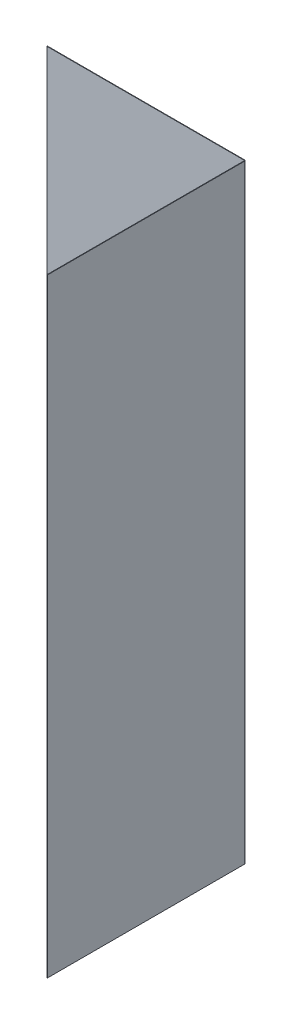
ISO-10303-21;
HEADER;
FILE_DESCRIPTION(('STEP AP214'),'2;1');
FILE_NAME('part.step','',(''),(''),'','','');
FILE_SCHEMA(('AUTOMOTIVE_DESIGN { 1 0 10303 214 1 1 1 1 }'));
ENDSEC;
DATA;
#1=APPLICATION_CONTEXT('core data for automotive mechanical design processes');
#2=APPLICATION_PROTOCOL_DEFINITION('international standard','automotive_design',2000,#1);
#3=PRODUCT_CONTEXT('',#1,'mechanical');
#4=PRODUCT('Part','Part','',(#3));
#5=PRODUCT_RELATED_PRODUCT_CATEGORY('part','',(#4));
#6=PRODUCT_DEFINITION_FORMATION('','',#4);
#7=PRODUCT_DEFINITION_CONTEXT('part definition',#1,'design');
#8=PRODUCT_DEFINITION('design','',#6,#7);
#9=PRODUCT_DEFINITION_SHAPE('','',#8);
#10=(LENGTH_UNIT() NAMED_UNIT(*) SI_UNIT(.MILLI.,.METRE.));
#11=(NAMED_UNIT(*) PLANE_ANGLE_UNIT() SI_UNIT($,.RADIAN.));
#12=(NAMED_UNIT(*) SI_UNIT($,.STERADIAN.) SOLID_ANGLE_UNIT());
#13=UNCERTAINTY_MEASURE_WITH_UNIT(LENGTH_MEASURE(1.E-05),#10,'distance_accuracy_value','');
#14=(GEOMETRIC_REPRESENTATION_CONTEXT(3) GLOBAL_UNCERTAINTY_ASSIGNED_CONTEXT((#13)) GLOBAL_UNIT_ASSIGNED_CONTEXT((#10,
#11,#12)) REPRESENTATION_CONTEXT('',''));
#15=CARTESIAN_POINT('',(0.,0.,0.));
#16=DIRECTION('',(0.,0.,1.));
#17=DIRECTION('',(1.,0.,0.));
#18=AXIS2_PLACEMENT_3D('',#15,#16,#17);
#19=CARTESIAN_POINT('',(-93.7000000000001,-731.,91.3));
#20=DIRECTION('',(0.,-1.,0.));
#21=DIRECTION('',(0.,0.,-1.));
#22=AXIS2_PLACEMENT_3D('',#19,#20,#21);
#23=PLANE('',#22);
#24=DIRECTION('',(0.,0.,1.));
#25=VECTOR('',#24,1.);
#26=CARTESIAN_POINT('',(-92.5,-731.,92.5));
#27=LINE('',#26,#25);
#28=CARTESIAN_POINT('',(-92.5,-731.,93.7));
#29=VERTEX_POINT('',#28);
#30=CARTESIAN_POINT('',(-92.5,-731.,567.5));
#31=VERTEX_POINT('',#30);
#32=EDGE_CURVE('E81',#29,#31,#27,.T.);
#33=ORIENTED_EDGE('',*,*,#32,.F.);
#34=DIRECTION('',(1.,0.,0.));
#35=VECTOR('',#34,1.);
#36=CARTESIAN_POINT('',(-92.5,-731.,93.7));
#37=LINE('',#36,#35);
#38=CARTESIAN_POINT('',(-91.3,-731.,93.7));
#39=VERTEX_POINT('',#38);
#40=EDGE_CURVE('E102',#29,#39,#37,.T.);
#41=ORIENTED_EDGE('',*,*,#40,.T.);
#42=DIRECTION('',(0.,0.,1.));
#43=VECTOR('',#42,1.);
#44=CARTESIAN_POINT('',(-91.3,-731.,92.5));
#45=LINE('',#44,#43);
#46=CARTESIAN_POINT('',(-91.3,-731.,567.5));
#47=VERTEX_POINT('',#46);
#48=EDGE_CURVE('E58',#39,#47,#45,.T.);
#49=ORIENTED_EDGE('',*,*,#48,.T.);
#50=DIRECTION('',(-1.,0.,0.));
#51=VECTOR('',#50,1.);
#52=CARTESIAN_POINT('',(-91.3,-731.,567.5));
#53=LINE('',#52,#51);
#54=EDGE_CURVE('E89',#47,#31,#53,.T.);
#55=ORIENTED_EDGE('',*,*,#54,.T.);
#56=EDGE_LOOP('',(#33,#41,#49,#55));
#57=FACE_BOUND('',#56,.T.);
#58=ADVANCED_FACE('F36',(#57),#23,.T.);
#59=CARTESIAN_POINT('',(-92.5,-731.,92.5));
#60=DIRECTION('',(-1.,0.,0.));
#61=DIRECTION('',(0.,0.,1.));
#62=AXIS2_PLACEMENT_3D('',#59,#60,#61);
#63=PLANE('',#62);
#64=DIRECTION('',(0.,0.,1.));
#65=VECTOR('',#64,1.);
#66=CARTESIAN_POINT('',(-92.5,731.,92.5));
#67=LINE('',#66,#65);
#68=CARTESIAN_POINT('',(-92.5,731.,93.7));
#69=VERTEX_POINT('',#68);
#70=CARTESIAN_POINT('',(-92.5,731.,567.5));
#71=VERTEX_POINT('',#70);
#72=EDGE_CURVE('E94',#69,#71,#67,.T.);
#73=ORIENTED_EDGE('',*,*,#72,.F.);
#74=DIRECTION('',(0.,1.,0.));
#75=VECTOR('',#74,1.);
#76=CARTESIAN_POINT('',(-92.5,-731.,93.7));
#77=LINE('',#76,#75);
#78=EDGE_CURVE('E43',#29,#69,#77,.T.);
#79=ORIENTED_EDGE('',*,*,#78,.F.);
#80=ORIENTED_EDGE('',*,*,#32,.T.);
#81=DIRECTION('',(0.,1.,0.));
#82=VECTOR('',#81,1.);
#83=CARTESIAN_POINT('',(-92.5,-731.,567.5));
#84=LINE('',#83,#82);
#85=EDGE_CURVE('E90',#31,#71,#84,.T.);
#86=ORIENTED_EDGE('',*,*,#85,.T.);
#87=EDGE_LOOP('',(#73,#79,#80,#86));
#88=FACE_BOUND('',#87,.T.);
#89=ADVANCED_FACE('F166',(#88),#63,.T.);
#90=CARTESIAN_POINT('',(-91.3,-731.,92.5));
#91=DIRECTION('',(-1.,0.,0.));
#92=DIRECTION('',(0.,0.,1.));
#93=AXIS2_PLACEMENT_3D('',#90,#91,#92);
#94=PLANE('',#93);
#95=DIRECTION('',(0.,0.,1.));
#96=VECTOR('',#95,1.);
#97=CARTESIAN_POINT('',(-91.3,731.,92.5));
#98=LINE('',#97,#96);
#99=CARTESIAN_POINT('',(-91.3,731.,93.7));
#100=VERTEX_POINT('',#99);
#101=CARTESIAN_POINT('',(-91.3,731.,567.5));
#102=VERTEX_POINT('',#101);
#103=EDGE_CURVE('E71',#100,#102,#98,.T.);
#104=ORIENTED_EDGE('',*,*,#103,.T.);
#105=DIRECTION('',(0.,1.,0.));
#106=VECTOR('',#105,1.);
#107=CARTESIAN_POINT('',(-91.3,-731.,567.5));
#108=LINE('',#107,#106);
#109=EDGE_CURVE('E74',#47,#102,#108,.T.);
#110=ORIENTED_EDGE('',*,*,#109,.F.);
#111=ORIENTED_EDGE('',*,*,#48,.F.);
#112=DIRECTION('',(0.,1.,0.));
#113=VECTOR('',#112,1.);
#114=CARTESIAN_POINT('',(-91.3,-731.,93.7));
#115=LINE('',#114,#113);
#116=EDGE_CURVE('E78',#39,#100,#115,.T.);
#117=ORIENTED_EDGE('',*,*,#116,.T.);
#118=EDGE_LOOP('',(#104,#110,#111,#117));
#119=FACE_BOUND('',#118,.T.);
#120=ADVANCED_FACE('F73',(#119),#94,.F.);
#121=CARTESIAN_POINT('',(-91.3,-731.,567.5));
#122=DIRECTION('',(0.,0.,-1.));
#123=DIRECTION('',(-1.,0.,0.));
#124=AXIS2_PLACEMENT_3D('',#121,#122,#123);
#125=PLANE('',#124);
#126=DIRECTION('',(-1.,0.,0.));
#127=VECTOR('',#126,1.);
#128=CARTESIAN_POINT('',(-91.3,731.,567.5));
#129=LINE('',#128,#127);
#130=EDGE_CURVE('E82',#102,#71,#129,.T.);
#131=ORIENTED_EDGE('',*,*,#130,.T.);
#132=ORIENTED_EDGE('',*,*,#85,.F.);
#133=ORIENTED_EDGE('',*,*,#54,.F.);
#134=ORIENTED_EDGE('',*,*,#109,.T.);
#135=EDGE_LOOP('',(#131,#132,#133,#134));
#136=FACE_BOUND('',#135,.T.);
#137=ADVANCED_FACE('F86',(#136),#125,.F.);
#138=CARTESIAN_POINT('',(-93.7000000000001,731.,93.7));
#139=DIRECTION('',(0.,1.,0.));
#140=DIRECTION('',(1.,0.,0.));
#141=AXIS2_PLACEMENT_3D('',#138,#139,#140);
#142=PLANE('',#141);
#143=ORIENTED_EDGE('',*,*,#72,.T.);
#144=ORIENTED_EDGE('',*,*,#130,.F.);
#145=ORIENTED_EDGE('',*,*,#103,.F.);
#146=DIRECTION('',(-1.,0.,0.));
#147=VECTOR('',#146,1.);
#148=CARTESIAN_POINT('',(-91.3,731.,93.7));
#149=LINE('',#148,#147);
#150=EDGE_CURVE('E11',#100,#69,#149,.T.);
#151=ORIENTED_EDGE('',*,*,#150,.T.);
#152=EDGE_LOOP('',(#143,#144,#145,#151));
#153=FACE_BOUND('',#152,.T.);
#154=ADVANCED_FACE('F92',(#153),#142,.T.);
#155=CARTESIAN_POINT('',(-567.5,-731.,92.5));
#156=DIRECTION('',(1.,0.,0.));
#157=DIRECTION('',(0.,0.,-1.));
#158=AXIS2_PLACEMENT_3D('',#155,#156,#157);
#159=PLANE('',#158);
#160=DIRECTION('',(0.,0.,-1.));
#161=VECTOR('',#160,1.);
#162=CARTESIAN_POINT('',(-567.5,731.,92.5));
#163=LINE('',#162,#161);
#164=CARTESIAN_POINT('',(-567.5,731.,92.5));
#165=VERTEX_POINT('',#164);
#166=CARTESIAN_POINT('',(-567.5,731.,91.3));
#167=VERTEX_POINT('',#166);
#168=EDGE_CURVE('E157',#165,#167,#163,.T.);
#169=ORIENTED_EDGE('',*,*,#168,.T.);
#170=DIRECTION('',(0.,1.,0.));
#171=VECTOR('',#170,1.);
#172=CARTESIAN_POINT('',(-567.5,-731.,91.3));
#173=LINE('',#172,#171);
#174=CARTESIAN_POINT('',(-567.5,-731.,91.3));
#175=VERTEX_POINT('',#174);
#176=EDGE_CURVE('E148',#175,#167,#173,.T.);
#177=ORIENTED_EDGE('',*,*,#176,.F.);
#178=DIRECTION('',(0.,0.,-1.));
#179=VECTOR('',#178,1.);
#180=CARTESIAN_POINT('',(-567.5,-731.,92.5));
#181=LINE('',#180,#179);
#182=CARTESIAN_POINT('',(-567.5,-731.,92.5));
#183=VERTEX_POINT('',#182);
#184=EDGE_CURVE('E139',#183,#175,#181,.T.);
#185=ORIENTED_EDGE('',*,*,#184,.F.);
#186=DIRECTION('',(0.,1.,0.));
#187=VECTOR('',#186,1.);
#188=CARTESIAN_POINT('',(-567.5,-731.,92.5));
#189=LINE('',#188,#187);
#190=EDGE_CURVE('E154',#183,#165,#189,.T.);
#191=ORIENTED_EDGE('',*,*,#190,.T.);
#192=EDGE_LOOP('',(#169,#177,#185,#191));
#193=FACE_BOUND('',#192,.T.);
#194=ADVANCED_FACE('F204',(#193),#159,.F.);
#195=CARTESIAN_POINT('',(-567.5,-731.,91.3));
#196=DIRECTION('',(0.,0.,1.));
#197=DIRECTION('',(1.,0.,0.));
#198=AXIS2_PLACEMENT_3D('',#195,#196,#197);
#199=PLANE('',#198);
#200=DIRECTION('',(1.,0.,0.));
#201=VECTOR('',#200,1.);
#202=CARTESIAN_POINT('',(-567.5,731.,91.3));
#203=LINE('',#202,#201);
#204=CARTESIAN_POINT('',(-93.7,731.,91.3));
#205=VERTEX_POINT('',#204);
#206=EDGE_CURVE('E151',#167,#205,#203,.T.);
#207=ORIENTED_EDGE('',*,*,#206,.T.);
#208=DIRECTION('',(0.,1.,0.));
#209=VECTOR('',#208,1.);
#210=CARTESIAN_POINT('',(-93.7,-731.,91.3));
#211=LINE('',#210,#209);
#212=CARTESIAN_POINT('',(-93.7,-731.,91.3));
#213=VERTEX_POINT('',#212);
#214=EDGE_CURVE('E160',#213,#205,#211,.T.);
#215=ORIENTED_EDGE('',*,*,#214,.F.);
#216=DIRECTION('',(1.,0.,0.));
#217=VECTOR('',#216,1.);
#218=CARTESIAN_POINT('',(-567.5,-731.,91.3));
#219=LINE('',#218,#217);
#220=EDGE_CURVE('E145',#175,#213,#219,.T.);
#221=ORIENTED_EDGE('',*,*,#220,.F.);
#222=ORIENTED_EDGE('',*,*,#176,.T.);
#223=EDGE_LOOP('',(#207,#215,#221,#222));
#224=FACE_BOUND('',#223,.T.);
#225=ADVANCED_FACE('F188',(#224),#199,.F.);
#226=CARTESIAN_POINT('',(-93.7,-731.,93.7));
#227=DIRECTION('',(0.,1.,0.));
#228=DIRECTION('',(1.,0.,0.));
#229=AXIS2_PLACEMENT_3D('',#226,#227,#228);
#230=PLANE('',#229);
#231=ORIENTED_EDGE('',*,*,#220,.T.);
#232=DIRECTION('',(0.,0.,1.));
#233=VECTOR('',#232,1.);
#234=CARTESIAN_POINT('',(-93.7,-731.,91.3));
#235=LINE('',#234,#233);
#236=CARTESIAN_POINT('',(-93.7,-731.,92.5));
#237=VERTEX_POINT('',#236);
#238=EDGE_CURVE('E142',#213,#237,#235,.T.);
#239=ORIENTED_EDGE('',*,*,#238,.T.);
#240=DIRECTION('',(1.,0.,0.));
#241=VECTOR('',#240,1.);
#242=CARTESIAN_POINT('',(-567.5,-731.,92.5));
#243=LINE('',#242,#241);
#244=EDGE_CURVE('E137',#183,#237,#243,.T.);
#245=ORIENTED_EDGE('',*,*,#244,.F.);
#246=ORIENTED_EDGE('',*,*,#184,.T.);
#247=EDGE_LOOP('',(#231,#239,#245,#246));
#248=FACE_BOUND('',#247,.T.);
#249=ADVANCED_FACE('F182',(#248),#230,.F.);
#250=CARTESIAN_POINT('',(-567.5,-731.,92.5));
#251=DIRECTION('',(0.,0.,1.));
#252=DIRECTION('',(1.,0.,0.));
#253=AXIS2_PLACEMENT_3D('',#250,#251,#252);
#254=PLANE('',#253);
#255=DIRECTION('',(1.,0.,0.));
#256=VECTOR('',#255,1.);
#257=CARTESIAN_POINT('',(-567.5,731.,92.5));
#258=LINE('',#257,#256);
#259=CARTESIAN_POINT('',(-93.7,731.,92.5));
#260=VERTEX_POINT('',#259);
#261=EDGE_CURVE('E133',#165,#260,#258,.T.);
#262=ORIENTED_EDGE('',*,*,#261,.F.);
#263=ORIENTED_EDGE('',*,*,#190,.F.);
#264=ORIENTED_EDGE('',*,*,#244,.T.);
#265=DIRECTION('',(0.,1.,0.));
#266=VECTOR('',#265,1.);
#267=CARTESIAN_POINT('',(-93.7,-731.,92.5));
#268=LINE('',#267,#266);
#269=EDGE_CURVE('E124',#237,#260,#268,.T.);
#270=ORIENTED_EDGE('',*,*,#269,.T.);
#271=EDGE_LOOP('',(#262,#263,#264,#270));
#272=FACE_BOUND('',#271,.T.);
#273=ADVANCED_FACE('F206',(#272),#254,.T.);
#274=CARTESIAN_POINT('',(-91.3,731.,93.7));
#275=DIRECTION('',(0.,1.,0.));
#276=DIRECTION('',(0.,0.,1.));
#277=AXIS2_PLACEMENT_3D('',#274,#275,#276);
#278=PLANE('',#277);
#279=ORIENTED_EDGE('',*,*,#261,.T.);
#280=DIRECTION('',(0.,0.,-1.));
#281=VECTOR('',#280,1.);
#282=CARTESIAN_POINT('',(-93.7,731.,92.5));
#283=LINE('',#282,#281);
#284=EDGE_CURVE('E96',#260,#205,#283,.T.);
#285=ORIENTED_EDGE('',*,*,#284,.T.);
#286=ORIENTED_EDGE('',*,*,#206,.F.);
#287=ORIENTED_EDGE('',*,*,#168,.F.);
#288=EDGE_LOOP('',(#279,#285,#286,#287));
#289=FACE_BOUND('',#288,.T.);
#290=ADVANCED_FACE('F194',(#289),#278,.T.);
#291=CARTESIAN_POINT('',(-93.7,-731.,93.7));
#292=DIRECTION('',(0.,-1.,0.));
#293=DIRECTION('',(0.,0.,-1.));
#294=AXIS2_PLACEMENT_3D('',#291,#292,#293);
#295=PLANE('',#294);
#296=ORIENTED_EDGE('',*,*,#40,.F.);
#297=CARTESIAN_POINT('',(-93.7,-731.,93.7));
#298=DIRECTION('',(0.,-1.,0.));
#299=DIRECTION('',(0.,0.,-1.));
#300=AXIS2_PLACEMENT_3D('',#297,#298,#299);
#301=CIRCLE('',#300,1.2);
#302=EDGE_CURVE('E117',#29,#237,#301,.F.);
#303=ORIENTED_EDGE('',*,*,#302,.T.);
#304=ORIENTED_EDGE('',*,*,#238,.F.);
#305=CARTESIAN_POINT('',(-93.7,-731.,93.7));
#306=DIRECTION('',(0.,1.,0.));
#307=DIRECTION('',(0.,0.,1.));
#308=AXIS2_PLACEMENT_3D('',#305,#306,#307);
#309=CIRCLE('',#308,2.4);
#310=EDGE_CURVE('E120',#39,#213,#309,.T.);
#311=ORIENTED_EDGE('',*,*,#310,.F.);
#312=EDGE_LOOP('',(#296,#303,#304,#311));
#313=FACE_BOUND('',#312,.T.);
#314=ADVANCED_FACE('F114',(#313),#295,.T.);
#315=CARTESIAN_POINT('',(-93.7,731.,93.7));
#316=DIRECTION('',(0.,1.,0.));
#317=DIRECTION('',(0.,0.,1.));
#318=AXIS2_PLACEMENT_3D('',#315,#316,#317);
#319=PLANE('',#318);
#320=ORIENTED_EDGE('',*,*,#284,.F.);
#321=CARTESIAN_POINT('',(-93.7,731.,93.7));
#322=DIRECTION('',(0.,-1.,0.));
#323=DIRECTION('',(0.,0.,-1.));
#324=AXIS2_PLACEMENT_3D('',#321,#322,#323);
#325=CIRCLE('',#324,1.2);
#326=EDGE_CURVE('E126',#260,#69,#325,.T.);
#327=ORIENTED_EDGE('',*,*,#326,.T.);
#328=ORIENTED_EDGE('',*,*,#150,.F.);
#329=CARTESIAN_POINT('',(-93.7,731.,93.7));
#330=DIRECTION('',(0.,-1.,0.));
#331=DIRECTION('',(0.,0.,-1.));
#332=AXIS2_PLACEMENT_3D('',#329,#330,#331);
#333=CIRCLE('',#332,2.4);
#334=EDGE_CURVE('E163',#205,#100,#333,.T.);
#335=ORIENTED_EDGE('',*,*,#334,.F.);
#336=EDGE_LOOP('',(#320,#327,#328,#335));
#337=FACE_BOUND('',#336,.T.);
#338=ADVANCED_FACE('F172',(#337),#319,.T.);
#339=CARTESIAN_POINT('',(-93.7,1462.0024625653,93.7));
#340=DIRECTION('',(0.,-1.,0.));
#341=DIRECTION('',(0.,0.,-1.));
#342=AXIS2_PLACEMENT_3D('',#339,#340,#341);
#343=CYLINDRICAL_SURFACE('',#342,2.4);
#344=ORIENTED_EDGE('',*,*,#334,.T.);
#345=ORIENTED_EDGE('',*,*,#116,.F.);
#346=ORIENTED_EDGE('',*,*,#310,.T.);
#347=ORIENTED_EDGE('',*,*,#214,.T.);
#348=EDGE_LOOP('',(#344,#345,#346,#347));
#349=FACE_BOUND('',#348,.T.);
#350=ADVANCED_FACE('F176',(#349),#343,.T.);
#351=CARTESIAN_POINT('',(-93.7,1462.0024625653,93.7));
#352=DIRECTION('',(0.,-1.,0.));
#353=DIRECTION('',(0.,0.,-1.));
#354=AXIS2_PLACEMENT_3D('',#351,#352,#353);
#355=CYLINDRICAL_SURFACE('',#354,1.2);
#356=ORIENTED_EDGE('',*,*,#326,.F.);
#357=ORIENTED_EDGE('',*,*,#269,.F.);
#358=ORIENTED_EDGE('',*,*,#302,.F.);
#359=ORIENTED_EDGE('',*,*,#78,.T.);
#360=EDGE_LOOP('',(#356,#357,#358,#359));
#361=FACE_BOUND('',#360,.T.);
#362=ADVANCED_FACE('F122',(#361),#355,.F.);
#363=CLOSED_SHELL('',(#58,#89,#120,#137,#154,#194,#225,#249,#273,#290,#314,#338,#350,#362));
#364=MANIFOLD_SOLID_BREP('B2',#363);
#365=ADVANCED_BREP_SHAPE_REPRESENTATION('',(#18,#364),#14);
#366=SHAPE_DEFINITION_REPRESENTATION(#9,#365);
ENDSEC;
END-ISO-10303-21;
